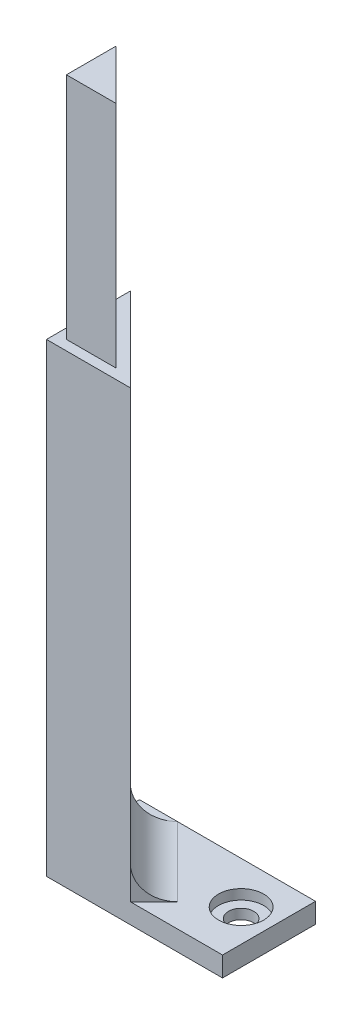
ISO-10303-21;
HEADER;
FILE_DESCRIPTION(('STEP AP214'),'2;1');
FILE_NAME('part.step','',(''),(''),'','','');
FILE_SCHEMA(('AUTOMOTIVE_DESIGN { 1 0 10303 214 1 1 1 1 }'));
ENDSEC;
DATA;
#1=APPLICATION_CONTEXT('core data for automotive mechanical design processes');
#2=APPLICATION_PROTOCOL_DEFINITION('international standard','automotive_design',2000,#1);
#3=PRODUCT_CONTEXT('',#1,'mechanical');
#4=PRODUCT('Part','Part','',(#3));
#5=PRODUCT_RELATED_PRODUCT_CATEGORY('part','',(#4));
#6=PRODUCT_DEFINITION_FORMATION('','',#4);
#7=PRODUCT_DEFINITION_CONTEXT('part definition',#1,'design');
#8=PRODUCT_DEFINITION('design','',#6,#7);
#9=PRODUCT_DEFINITION_SHAPE('','',#8);
#10=(LENGTH_UNIT() NAMED_UNIT(*) SI_UNIT(.MILLI.,.METRE.));
#11=(NAMED_UNIT(*) PLANE_ANGLE_UNIT() SI_UNIT($,.RADIAN.));
#12=(NAMED_UNIT(*) SI_UNIT($,.STERADIAN.) SOLID_ANGLE_UNIT());
#13=UNCERTAINTY_MEASURE_WITH_UNIT(LENGTH_MEASURE(1.E-05),#10,'distance_accuracy_value','');
#14=(GEOMETRIC_REPRESENTATION_CONTEXT(3) GLOBAL_UNCERTAINTY_ASSIGNED_CONTEXT((#13)) GLOBAL_UNIT_ASSIGNED_CONTEXT((#10,
#11,#12)) REPRESENTATION_CONTEXT('',''));
#15=CARTESIAN_POINT('',(0.,0.,0.));
#16=DIRECTION('',(0.,0.,1.));
#17=DIRECTION('',(1.,0.,0.));
#18=AXIS2_PLACEMENT_3D('',#15,#16,#17);
#19=CARTESIAN_POINT('',(40.3,6.,-12.3));
#20=DIRECTION('',(0.,-1.,0.));
#21=DIRECTION('',(0.,0.,-1.));
#22=AXIS2_PLACEMENT_3D('',#19,#20,#21);
#23=CYLINDRICAL_SURFACE('',#22,3.8);
#24=CARTESIAN_POINT('',(40.3,0.,-12.3));
#25=DIRECTION('',(0.,-1.,0.));
#26=DIRECTION('',(0.,0.,-1.));
#27=AXIS2_PLACEMENT_3D('',#24,#25,#26);
#28=CIRCLE('',#27,3.8);
#29=CARTESIAN_POINT('',(40.3,0.,-16.1));
#30=VERTEX_POINT('',#29);
#31=EDGE_CURVE('E164',#30,#30,#28,.T.);
#32=ORIENTED_EDGE('',*,*,#31,.T.);
#33=EDGE_LOOP('',(#32));
#34=FACE_BOUND('',#33,.T.);
#35=CARTESIAN_POINT('',(40.3,3.,-12.3));
#36=DIRECTION('',(0.,1.,0.));
#37=DIRECTION('',(0.,0.,1.));
#38=AXIS2_PLACEMENT_3D('',#35,#36,#37);
#39=CIRCLE('',#38,3.8);
#40=CARTESIAN_POINT('',(40.3,3.,-8.5));
#41=VERTEX_POINT('',#40);
#42=EDGE_CURVE('E44',#41,#41,#39,.F.);
#43=ORIENTED_EDGE('',*,*,#42,.F.);
#44=EDGE_LOOP('',(#43));
#45=FACE_BOUND('',#44,.T.);
#46=ADVANCED_FACE('F40',(#34,#45),#23,.F.);
#47=CARTESIAN_POINT('',(22.2426406871193,140.,3.));
#48=DIRECTION('',(0.707106781186547,0.,-0.707106781186547));
#49=DIRECTION('',(-0.707106781186548,0.,-0.707106781186548));
#50=AXIS2_PLACEMENT_3D('',#47,#48,#49);
#51=PLANE('',#50);
#52=DIRECTION('',(0.707106781186548,0.,0.707106781186547));
#53=VECTOR('',#52,1.);
#54=CARTESIAN_POINT('',(1.31370849898475,16.,-17.9289321881345));
#55=LINE('',#54,#53);
#56=CARTESIAN_POINT('',(1.31370849898476,16.,-17.9289321881345));
#57=VERTEX_POINT('',#56);
#58=CARTESIAN_POINT('',(22.2426406871193,16.,3.));
#59=VERTEX_POINT('',#58);
#60=EDGE_CURVE('E129',#57,#59,#55,.T.);
#61=ORIENTED_EDGE('',*,*,#60,.F.);
#62=DIRECTION('',(0.,-1.,0.));
#63=VECTOR('',#62,1.);
#64=CARTESIAN_POINT('',(1.31370849898475,16.,-17.9289321881345));
#65=LINE('',#64,#63);
#66=CARTESIAN_POINT('',(1.31370849898475,6.,-17.9289321881345));
#67=VERTEX_POINT('',#66);
#68=EDGE_CURVE('E158',#57,#67,#65,.T.);
#69=ORIENTED_EDGE('',*,*,#68,.T.);
#70=DIRECTION('',(0.707106781186548,0.,0.707106781186548));
#71=VECTOR('',#70,1.);
#72=CARTESIAN_POINT('',(9.62132034355964,6.,-9.62132034355964));
#73=LINE('',#72,#71);
#74=CARTESIAN_POINT('',(-3.,6.,-22.2426406871193));
#75=VERTEX_POINT('',#74);
#76=EDGE_CURVE('E172',#75,#67,#73,.T.);
#77=ORIENTED_EDGE('',*,*,#76,.F.);
#78=DIRECTION('',(0.,-1.,0.));
#79=VECTOR('',#78,1.);
#80=CARTESIAN_POINT('',(-3.,140.,-22.2426406871193));
#81=LINE('',#80,#79);
#82=CARTESIAN_POINT('',(-3.,140.,-22.2426406871193));
#83=VERTEX_POINT('',#82);
#84=EDGE_CURVE('E223',#83,#75,#81,.T.);
#85=ORIENTED_EDGE('',*,*,#84,.F.);
#86=DIRECTION('',(0.707106781186547,0.,0.707106781186547));
#87=VECTOR('',#86,1.);
#88=CARTESIAN_POINT('',(22.2426406871193,140.,3.));
#89=LINE('',#88,#87);
#90=CARTESIAN_POINT('',(22.2426406871193,140.,3.));
#91=VERTEX_POINT('',#90);
#92=EDGE_CURVE('E204',#83,#91,#89,.T.);
#93=ORIENTED_EDGE('',*,*,#92,.T.);
#94=DIRECTION('',(0.,-1.,0.));
#95=VECTOR('',#94,1.);
#96=CARTESIAN_POINT('',(22.2426406871193,140.,3.));
#97=LINE('',#96,#95);
#98=EDGE_CURVE('E217',#91,#59,#97,.T.);
#99=ORIENTED_EDGE('',*,*,#98,.T.);
#100=EDGE_LOOP('',(#61,#69,#77,#85,#93,#99));
#101=FACE_BOUND('',#100,.T.);
#102=ADVANCED_FACE('F286',(#101),#51,.T.);
#103=CARTESIAN_POINT('',(0.,6.,0.));
#104=DIRECTION('',(0.,-1.,0.));
#105=DIRECTION('',(0.,0.,-1.));
#106=AXIS2_PLACEMENT_3D('',#103,#104,#105);
#107=PLANE('',#106);
#108=CARTESIAN_POINT('',(40.3,6.,-12.3));
#109=DIRECTION('',(0.,1.,0.));
#110=DIRECTION('',(0.,0.,1.));
#111=AXIS2_PLACEMENT_3D('',#108,#109,#110);
#112=CIRCLE('',#111,6.80000000000001);
#113=CARTESIAN_POINT('',(40.3,6.,-5.5));
#114=VERTEX_POINT('',#113);
#115=EDGE_CURVE('E333',#114,#114,#112,.T.);
#116=ORIENTED_EDGE('',*,*,#115,.F.);
#117=EDGE_LOOP('',(#116));
#118=FACE_BOUND('',#117,.T.);
#119=DIRECTION('',(0.707106781186548,0.,-0.707106781186547));
#120=VECTOR('',#119,1.);
#121=CARTESIAN_POINT('',(22.2426406871193,6.,3.));
#122=LINE('',#121,#120);
#123=CARTESIAN_POINT('',(22.2426406871193,6.,3.));
#124=VERTEX_POINT('',#123);
#125=CARTESIAN_POINT('',(29.3137084989848,6.,-4.07106781186547));
#126=VERTEX_POINT('',#125);
#127=EDGE_CURVE('E139',#124,#126,#122,.T.);
#128=ORIENTED_EDGE('',*,*,#127,.F.);
#129=DIRECTION('',(1.,0.,0.));
#130=VECTOR('',#129,1.);
#131=CARTESIAN_POINT('',(0.,6.,3.));
#132=LINE('',#131,#130);
#133=CARTESIAN_POINT('',(50.,6.,3.));
#134=VERTEX_POINT('',#133);
#135=EDGE_CURVE('E168',#124,#134,#132,.T.);
#136=ORIENTED_EDGE('',*,*,#135,.T.);
#137=DIRECTION('',(0.,0.,-1.));
#138=VECTOR('',#137,1.);
#139=CARTESIAN_POINT('',(50.,6.,0.));
#140=LINE('',#139,#138);
#141=CARTESIAN_POINT('',(50.,6.,-25.));
#142=VERTEX_POINT('',#141);
#143=EDGE_CURVE('E165',#134,#142,#140,.T.);
#144=ORIENTED_EDGE('',*,*,#143,.T.);
#145=DIRECTION('',(1.,0.,0.));
#146=VECTOR('',#145,1.);
#147=CARTESIAN_POINT('',(0.,6.,-25.));
#148=LINE('',#147,#146);
#149=CARTESIAN_POINT('',(8.38477631085023,6.,-25.));
#150=VERTEX_POINT('',#149);
#151=EDGE_CURVE('E142',#150,#142,#148,.T.);
#152=ORIENTED_EDGE('',*,*,#151,.F.);
#153=DIRECTION('',(-0.707106781186548,0.,-0.707106781186547));
#154=VECTOR('',#153,1.);
#155=CARTESIAN_POINT('',(29.3137084989848,6.,-4.07106781186547));
#156=LINE('',#155,#154);
#157=EDGE_CURVE('E128',#126,#150,#156,.T.);
#158=ORIENTED_EDGE('',*,*,#157,.F.);
#159=EDGE_LOOP('',(#128,#136,#144,#152,#158));
#160=FACE_BOUND('',#159,.T.);
#161=ADVANCED_FACE('F138',(#118,#160),#107,.F.);
#162=DIRECTION('',(-0.707106781186547,0.,0.707106781186548));
#163=VECTOR('',#162,1.);
#164=CARTESIAN_POINT('',(8.38477631085023,6.,-25.));
#165=LINE('',#164,#163);
#166=EDGE_CURVE('E145',#150,#67,#165,.T.);
#167=ORIENTED_EDGE('',*,*,#166,.F.);
#168=CARTESIAN_POINT('',(-3.,6.,-25.));
#169=VERTEX_POINT('',#168);
#170=EDGE_CURVE('E179',#169,#150,#148,.T.);
#171=ORIENTED_EDGE('',*,*,#170,.F.);
#172=DIRECTION('',(0.,0.,-1.));
#173=VECTOR('',#172,1.);
#174=CARTESIAN_POINT('',(-3.,6.,0.));
#175=LINE('',#174,#173);
#176=EDGE_CURVE('E175',#75,#169,#175,.T.);
#177=ORIENTED_EDGE('',*,*,#176,.F.);
#178=ORIENTED_EDGE('',*,*,#76,.T.);
#179=EDGE_LOOP('',(#167,#171,#177,#178));
#180=FACE_BOUND('',#179,.T.);
#181=ADVANCED_FACE('F306',(#180),#107,.F.);
#182=CARTESIAN_POINT('',(0.,320.,0.));
#183=DIRECTION('',(0.,0.,-1.));
#184=DIRECTION('',(-1.,0.,0.));
#185=AXIS2_PLACEMENT_3D('',#182,#183,#184);
#186=PLANE('',#185);
#187=DIRECTION('',(0.,-1.,0.));
#188=VECTOR('',#187,1.);
#189=CARTESIAN_POINT('',(0.,320.,0.));
#190=LINE('',#189,#188);
#191=CARTESIAN_POINT('',(0.,209.,0.));
#192=VERTEX_POINT('',#191);
#193=CARTESIAN_POINT('',(0.,140.,0.));
#194=VERTEX_POINT('',#193);
#195=EDGE_CURVE('E248',#192,#194,#190,.T.);
#196=ORIENTED_EDGE('',*,*,#195,.T.);
#197=DIRECTION('',(1.,0.,0.));
#198=VECTOR('',#197,1.);
#199=CARTESIAN_POINT('',(0.,140.,0.));
#200=LINE('',#199,#198);
#201=CARTESIAN_POINT('',(15.,140.,0.));
#202=VERTEX_POINT('',#201);
#203=EDGE_CURVE('E65',#194,#202,#200,.T.);
#204=ORIENTED_EDGE('',*,*,#203,.T.);
#205=DIRECTION('',(0.,-1.,0.));
#206=VECTOR('',#205,1.);
#207=CARTESIAN_POINT('',(15.,320.,0.));
#208=LINE('',#207,#206);
#209=CARTESIAN_POINT('',(15.,209.,0.));
#210=VERTEX_POINT('',#209);
#211=EDGE_CURVE('E50',#210,#202,#208,.T.);
#212=ORIENTED_EDGE('',*,*,#211,.F.);
#213=DIRECTION('',(1.,0.,0.));
#214=VECTOR('',#213,1.);
#215=CARTESIAN_POINT('',(15.,209.,0.));
#216=LINE('',#215,#214);
#217=EDGE_CURVE('E238',#192,#210,#216,.T.);
#218=ORIENTED_EDGE('',*,*,#217,.F.);
#219=EDGE_LOOP('',(#196,#204,#212,#218));
#220=FACE_BOUND('',#219,.T.);
#221=ADVANCED_FACE('F42',(#220),#186,.F.);
#222=CARTESIAN_POINT('',(0.,320.,-15.));
#223=DIRECTION('',(-0.707106781186548,0.,0.707106781186548));
#224=DIRECTION('',(0.707106781186548,0.,0.707106781186548));
#225=AXIS2_PLACEMENT_3D('',#222,#223,#224);
#226=PLANE('',#225);
#227=ORIENTED_EDGE('',*,*,#211,.T.);
#228=DIRECTION('',(-0.707106781186548,0.,-0.707106781186548));
#229=VECTOR('',#228,1.);
#230=CARTESIAN_POINT('',(0.,140.,-15.));
#231=LINE('',#230,#229);
#232=CARTESIAN_POINT('',(0.,140.,-15.));
#233=VERTEX_POINT('',#232);
#234=EDGE_CURVE('E226',#202,#233,#231,.T.);
#235=ORIENTED_EDGE('',*,*,#234,.T.);
#236=DIRECTION('',(0.,-1.,0.));
#237=VECTOR('',#236,1.);
#238=CARTESIAN_POINT('',(0.,320.,-15.));
#239=LINE('',#238,#237);
#240=CARTESIAN_POINT('',(0.,209.,-15.));
#241=VERTEX_POINT('',#240);
#242=EDGE_CURVE('E252',#241,#233,#239,.T.);
#243=ORIENTED_EDGE('',*,*,#242,.F.);
#244=DIRECTION('',(0.707106781186548,0.,0.707106781186548));
#245=VECTOR('',#244,1.);
#246=CARTESIAN_POINT('',(0.,209.,-15.));
#247=LINE('',#246,#245);
#248=EDGE_CURVE('E244',#241,#210,#247,.T.);
#249=ORIENTED_EDGE('',*,*,#248,.T.);
#250=EDGE_LOOP('',(#227,#235,#243,#249));
#251=FACE_BOUND('',#250,.T.);
#252=ADVANCED_FACE('F260',(#251),#226,.F.);
#253=CARTESIAN_POINT('',(0.,320.,0.));
#254=DIRECTION('',(1.,0.,0.));
#255=DIRECTION('',(0.,0.,-1.));
#256=AXIS2_PLACEMENT_3D('',#253,#254,#255);
#257=PLANE('',#256);
#258=ORIENTED_EDGE('',*,*,#242,.T.);
#259=DIRECTION('',(0.,0.,1.));
#260=VECTOR('',#259,1.);
#261=CARTESIAN_POINT('',(0.,140.,0.));
#262=LINE('',#261,#260);
#263=EDGE_CURVE('E11',#233,#194,#262,.T.);
#264=ORIENTED_EDGE('',*,*,#263,.T.);
#265=ORIENTED_EDGE('',*,*,#195,.F.);
#266=DIRECTION('',(0.,0.,1.));
#267=VECTOR('',#266,1.);
#268=CARTESIAN_POINT('',(0.,209.,-15.));
#269=LINE('',#268,#267);
#270=EDGE_CURVE('E241',#241,#192,#269,.T.);
#271=ORIENTED_EDGE('',*,*,#270,.F.);
#272=EDGE_LOOP('',(#258,#264,#265,#271));
#273=FACE_BOUND('',#272,.T.);
#274=ADVANCED_FACE('F267',(#273),#257,.F.);
#275=CARTESIAN_POINT('',(15.,209.,-15.));
#276=DIRECTION('',(0.,-1.,0.));
#277=DIRECTION('',(0.,0.,-1.));
#278=AXIS2_PLACEMENT_3D('',#275,#276,#277);
#279=PLANE('',#278);
#280=ORIENTED_EDGE('',*,*,#270,.T.);
#281=ORIENTED_EDGE('',*,*,#217,.T.);
#282=ORIENTED_EDGE('',*,*,#248,.F.);
#283=EDGE_LOOP('',(#280,#281,#282));
#284=FACE_BOUND('',#283,.T.);
#285=ADVANCED_FACE('F271',(#284),#279,.F.);
#286=CARTESIAN_POINT('',(0.,140.,0.));
#287=DIRECTION('',(0.,1.,0.));
#288=DIRECTION('',(0.,0.,1.));
#289=AXIS2_PLACEMENT_3D('',#286,#287,#288);
#290=PLANE('',#289);
#291=ORIENTED_EDGE('',*,*,#92,.F.);
#292=DIRECTION('',(0.,0.,-1.));
#293=VECTOR('',#292,1.);
#294=CARTESIAN_POINT('',(-3.,140.,-22.2426406871193));
#295=LINE('',#294,#293);
#296=CARTESIAN_POINT('',(-3.,140.,3.));
#297=VERTEX_POINT('',#296);
#298=EDGE_CURVE('E213',#297,#83,#295,.T.);
#299=ORIENTED_EDGE('',*,*,#298,.F.);
#300=DIRECTION('',(-1.,0.,0.));
#301=VECTOR('',#300,1.);
#302=CARTESIAN_POINT('',(-3.,140.,3.));
#303=LINE('',#302,#301);
#304=EDGE_CURVE('E208',#91,#297,#303,.T.);
#305=ORIENTED_EDGE('',*,*,#304,.F.);
#306=EDGE_LOOP('',(#291,#299,#305));
#307=FACE_BOUND('',#306,.T.);
#308=ORIENTED_EDGE('',*,*,#203,.F.);
#309=ORIENTED_EDGE('',*,*,#263,.F.);
#310=ORIENTED_EDGE('',*,*,#234,.F.);
#311=EDGE_LOOP('',(#308,#309,#310));
#312=FACE_BOUND('',#311,.T.);
#313=ADVANCED_FACE('F268',(#307,#312),#290,.T.);
#314=CARTESIAN_POINT('',(-3.,140.,-22.2426406871193));
#315=DIRECTION('',(-1.,0.,0.));
#316=DIRECTION('',(0.,0.,1.));
#317=AXIS2_PLACEMENT_3D('',#314,#315,#316);
#318=PLANE('',#317);
#319=DIRECTION('',(0.,0.,-1.));
#320=VECTOR('',#319,1.);
#321=CARTESIAN_POINT('',(-3.,0.,-22.2426406871193));
#322=LINE('',#321,#320);
#323=CARTESIAN_POINT('',(-3.,0.,3.));
#324=VERTEX_POINT('',#323);
#325=CARTESIAN_POINT('',(-3.,0.,-25.));
#326=VERTEX_POINT('',#325);
#327=EDGE_CURVE('E209',#324,#326,#322,.T.);
#328=ORIENTED_EDGE('',*,*,#327,.F.);
#329=DIRECTION('',(0.,-1.,0.));
#330=VECTOR('',#329,1.);
#331=CARTESIAN_POINT('',(-3.,140.,3.));
#332=LINE('',#331,#330);
#333=EDGE_CURVE('E227',#297,#324,#332,.T.);
#334=ORIENTED_EDGE('',*,*,#333,.F.);
#335=ORIENTED_EDGE('',*,*,#298,.T.);
#336=ORIENTED_EDGE('',*,*,#84,.T.);
#337=ORIENTED_EDGE('',*,*,#176,.T.);
#338=DIRECTION('',(0.,-1.,0.));
#339=VECTOR('',#338,1.);
#340=CARTESIAN_POINT('',(-3.,6.,-25.));
#341=LINE('',#340,#339);
#342=EDGE_CURVE('E197',#169,#326,#341,.T.);
#343=ORIENTED_EDGE('',*,*,#342,.T.);
#344=EDGE_LOOP('',(#328,#334,#335,#336,#337,#343));
#345=FACE_BOUND('',#344,.T.);
#346=ADVANCED_FACE('F270',(#345),#318,.T.);
#347=CARTESIAN_POINT('',(-3.,140.,3.));
#348=DIRECTION('',(0.,0.,1.));
#349=DIRECTION('',(1.,0.,0.));
#350=AXIS2_PLACEMENT_3D('',#347,#348,#349);
#351=PLANE('',#350);
#352=DIRECTION('',(-1.,0.,0.));
#353=VECTOR('',#352,1.);
#354=CARTESIAN_POINT('',(-3.,0.,3.));
#355=LINE('',#354,#353);
#356=CARTESIAN_POINT('',(50.,0.,3.));
#357=VERTEX_POINT('',#356);
#358=EDGE_CURVE('E196',#357,#324,#355,.T.);
#359=ORIENTED_EDGE('',*,*,#358,.F.);
#360=DIRECTION('',(0.,-1.,0.));
#361=VECTOR('',#360,1.);
#362=CARTESIAN_POINT('',(50.,6.,3.));
#363=LINE('',#362,#361);
#364=EDGE_CURVE('E182',#134,#357,#363,.T.);
#365=ORIENTED_EDGE('',*,*,#364,.F.);
#366=ORIENTED_EDGE('',*,*,#135,.F.);
#367=DIRECTION('',(0.,-1.,0.));
#368=VECTOR('',#367,1.);
#369=CARTESIAN_POINT('',(22.2426406871193,16.,3.));
#370=LINE('',#369,#368);
#371=EDGE_CURVE('E148',#59,#124,#370,.T.);
#372=ORIENTED_EDGE('',*,*,#371,.F.);
#373=ORIENTED_EDGE('',*,*,#98,.F.);
#374=ORIENTED_EDGE('',*,*,#304,.T.);
#375=ORIENTED_EDGE('',*,*,#333,.T.);
#376=EDGE_LOOP('',(#359,#365,#366,#372,#373,#374,#375));
#377=FACE_BOUND('',#376,.T.);
#378=ADVANCED_FACE('F278',(#377),#351,.T.);
#379=CARTESIAN_POINT('',(0.,0.,0.));
#380=DIRECTION('',(0.,1.,0.));
#381=DIRECTION('',(0.,0.,1.));
#382=AXIS2_PLACEMENT_3D('',#379,#380,#381);
#383=PLANE('',#382);
#384=ORIENTED_EDGE('',*,*,#327,.T.);
#385=DIRECTION('',(1.,0.,0.));
#386=VECTOR('',#385,1.);
#387=CARTESIAN_POINT('',(0.,0.,-25.));
#388=LINE('',#387,#386);
#389=CARTESIAN_POINT('',(50.,0.,-25.));
#390=VERTEX_POINT('',#389);
#391=EDGE_CURVE('E169',#326,#390,#388,.T.);
#392=ORIENTED_EDGE('',*,*,#391,.T.);
#393=DIRECTION('',(0.,0.,-1.));
#394=VECTOR('',#393,1.);
#395=CARTESIAN_POINT('',(50.,0.,0.));
#396=LINE('',#395,#394);
#397=EDGE_CURVE('E186',#357,#390,#396,.T.);
#398=ORIENTED_EDGE('',*,*,#397,.F.);
#399=ORIENTED_EDGE('',*,*,#358,.T.);
#400=EDGE_LOOP('',(#384,#392,#398,#399));
#401=FACE_BOUND('',#400,.T.);
#402=ORIENTED_EDGE('',*,*,#31,.F.);
#403=EDGE_LOOP('',(#402));
#404=FACE_BOUND('',#403,.T.);
#405=ADVANCED_FACE('F299',(#401,#404),#383,.F.);
#406=CARTESIAN_POINT('',(50.,6.,0.));
#407=DIRECTION('',(-1.,0.,0.));
#408=DIRECTION('',(0.,0.,1.));
#409=AXIS2_PLACEMENT_3D('',#406,#407,#408);
#410=PLANE('',#409);
#411=ORIENTED_EDGE('',*,*,#397,.T.);
#412=DIRECTION('',(0.,-1.,0.));
#413=VECTOR('',#412,1.);
#414=CARTESIAN_POINT('',(50.,6.,-25.));
#415=LINE('',#414,#413);
#416=EDGE_CURVE('E193',#142,#390,#415,.T.);
#417=ORIENTED_EDGE('',*,*,#416,.F.);
#418=ORIENTED_EDGE('',*,*,#143,.F.);
#419=ORIENTED_EDGE('',*,*,#364,.T.);
#420=EDGE_LOOP('',(#411,#417,#418,#419));
#421=FACE_BOUND('',#420,.T.);
#422=ADVANCED_FACE('F295',(#421),#410,.F.);
#423=CARTESIAN_POINT('',(0.,6.,-25.));
#424=DIRECTION('',(0.,0.,-1.));
#425=DIRECTION('',(-1.,0.,0.));
#426=AXIS2_PLACEMENT_3D('',#423,#424,#425);
#427=PLANE('',#426);
#428=ORIENTED_EDGE('',*,*,#391,.F.);
#429=ORIENTED_EDGE('',*,*,#342,.F.);
#430=ORIENTED_EDGE('',*,*,#170,.T.);
#431=ORIENTED_EDGE('',*,*,#151,.T.);
#432=ORIENTED_EDGE('',*,*,#416,.T.);
#433=EDGE_LOOP('',(#428,#429,#430,#431,#432));
#434=FACE_BOUND('',#433,.T.);
#435=ADVANCED_FACE('F298',(#434),#427,.T.);
#436=CARTESIAN_POINT('',(22.2426406871193,16.,3.));
#437=DIRECTION('',(-0.707106781186547,0.,-0.707106781186548));
#438=DIRECTION('',(-0.707106781186548,0.,0.707106781186547));
#439=AXIS2_PLACEMENT_3D('',#436,#437,#438);
#440=PLANE('',#439);
#441=ORIENTED_EDGE('',*,*,#127,.T.);
#442=CARTESIAN_POINT('',(29.3137084989848,16.,-4.07106781186547));
#443=DIRECTION('',(0.707106781186548,0.,0.707106781186548));
#444=DIRECTION('',(0.707106781186548,0.,-0.707106781186548));
#445=AXIS2_PLACEMENT_3D('',#442,#443,#444);
#446=CIRCLE('',#445,10.);
#447=EDGE_CURVE('E125',#59,#126,#446,.T.);
#448=ORIENTED_EDGE('',*,*,#447,.F.);
#449=ORIENTED_EDGE('',*,*,#371,.T.);
#450=EDGE_LOOP('',(#441,#448,#449));
#451=FACE_BOUND('',#450,.T.);
#452=ADVANCED_FACE('F147',(#451),#440,.F.);
#453=CARTESIAN_POINT('',(8.38477631085023,16.,-25.));
#454=DIRECTION('',(0.707106781186548,0.,0.707106781186547));
#455=DIRECTION('',(0.707106781186547,0.,-0.707106781186548));
#456=AXIS2_PLACEMENT_3D('',#453,#454,#455);
#457=PLANE('',#456);
#458=ORIENTED_EDGE('',*,*,#68,.F.);
#459=CARTESIAN_POINT('',(8.38477631085023,16.,-25.));
#460=DIRECTION('',(0.707106781186548,0.,0.707106781186547));
#461=DIRECTION('',(0.707106781186547,0.,-0.707106781186548));
#462=AXIS2_PLACEMENT_3D('',#459,#460,#461);
#463=CIRCLE('',#462,10.);
#464=EDGE_CURVE('E57',#57,#150,#463,.T.);
#465=ORIENTED_EDGE('',*,*,#464,.T.);
#466=ORIENTED_EDGE('',*,*,#166,.T.);
#467=EDGE_LOOP('',(#458,#465,#466));
#468=FACE_BOUND('',#467,.T.);
#469=ADVANCED_FACE('F310',(#468),#457,.F.);
#470=CARTESIAN_POINT('',(2.69238815542511,16.,-30.6923881554251));
#471=DIRECTION('',(0.707106781186548,0.,0.707106781186548));
#472=DIRECTION('',(0.707106781186548,0.,-0.707106781186548));
#473=AXIS2_PLACEMENT_3D('',#470,#471,#472);
#474=CYLINDRICAL_SURFACE('',#473,10.);
#475=ORIENTED_EDGE('',*,*,#60,.T.);
#476=ORIENTED_EDGE('',*,*,#447,.T.);
#477=ORIENTED_EDGE('',*,*,#157,.T.);
#478=ORIENTED_EDGE('',*,*,#464,.F.);
#479=EDGE_LOOP('',(#475,#476,#477,#478));
#480=FACE_BOUND('',#479,.T.);
#481=ADVANCED_FACE('F127',(#480),#474,.F.);
#482=CARTESIAN_POINT('',(40.3,3.,-12.3));
#483=DIRECTION('',(0.,1.,0.));
#484=DIRECTION('',(0.,0.,1.));
#485=AXIS2_PLACEMENT_3D('',#482,#483,#484);
#486=PLANE('',#485);
#487=CARTESIAN_POINT('',(40.3,3.,-12.3));
#488=DIRECTION('',(0.,1.,0.));
#489=DIRECTION('',(0.,0.,1.));
#490=AXIS2_PLACEMENT_3D('',#487,#488,#489);
#491=CIRCLE('',#490,6.80000000000001);
#492=CARTESIAN_POINT('',(40.3,3.,-5.5));
#493=VERTEX_POINT('',#492);
#494=EDGE_CURVE('E328',#493,#493,#491,.T.);
#495=ORIENTED_EDGE('',*,*,#494,.T.);
#496=EDGE_LOOP('',(#495));
#497=FACE_BOUND('',#496,.T.);
#498=ORIENTED_EDGE('',*,*,#42,.T.);
#499=EDGE_LOOP('',(#498));
#500=FACE_BOUND('',#499,.T.);
#501=ADVANCED_FACE('F316',(#497,#500),#486,.T.);
#502=CARTESIAN_POINT('',(40.3,3.,-12.3));
#503=DIRECTION('',(0.,1.,0.));
#504=DIRECTION('',(0.,0.,1.));
#505=AXIS2_PLACEMENT_3D('',#502,#503,#504);
#506=CYLINDRICAL_SURFACE('',#505,6.80000000000001);
#507=ORIENTED_EDGE('',*,*,#494,.F.);
#508=EDGE_LOOP('',(#507));
#509=FACE_BOUND('',#508,.T.);
#510=ORIENTED_EDGE('',*,*,#115,.T.);
#511=EDGE_LOOP('',(#510));
#512=FACE_BOUND('',#511,.T.);
#513=ADVANCED_FACE('F317',(#509,#512),#506,.F.);
#514=CLOSED_SHELL('',(#46,#102,#161,#181,#221,#252,#274,#285,#313,#346,#378,#405,#422,#435,#452,
#469,#481,#501,#513));
#515=MANIFOLD_SOLID_BREP('B2',#514);
#516=ADVANCED_BREP_SHAPE_REPRESENTATION('',(#18,#515),#14);
#517=SHAPE_DEFINITION_REPRESENTATION(#9,#516);
ENDSEC;
END-ISO-10303-21;
